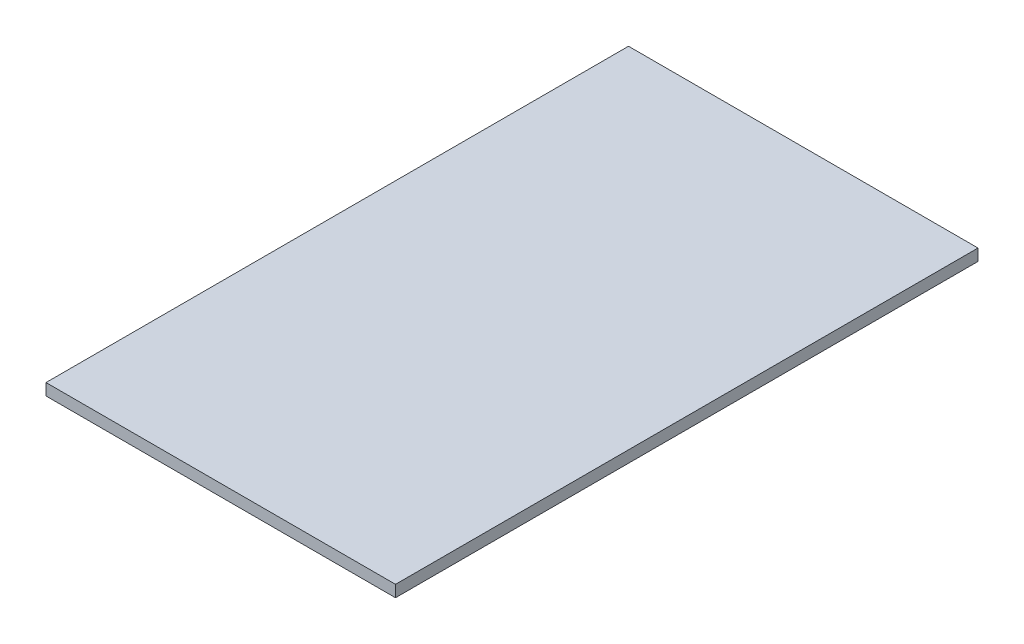
ISO-10303-21;
HEADER;
FILE_DESCRIPTION(('STEP AP214'),'2;1');
FILE_NAME('part.step','',(''),(''),'','','');
FILE_SCHEMA(('AUTOMOTIVE_DESIGN { 1 0 10303 214 1 1 1 1 }'));
ENDSEC;
DATA;
#1=APPLICATION_CONTEXT('core data for automotive mechanical design processes');
#2=APPLICATION_PROTOCOL_DEFINITION('international standard','automotive_design',2000,#1);
#3=PRODUCT_CONTEXT('',#1,'mechanical');
#4=PRODUCT('Part','Part','',(#3));
#5=PRODUCT_RELATED_PRODUCT_CATEGORY('part','',(#4));
#6=PRODUCT_DEFINITION_FORMATION('','',#4);
#7=PRODUCT_DEFINITION_CONTEXT('part definition',#1,'design');
#8=PRODUCT_DEFINITION('design','',#6,#7);
#9=PRODUCT_DEFINITION_SHAPE('','',#8);
#10=(LENGTH_UNIT() NAMED_UNIT(*) SI_UNIT(.MILLI.,.METRE.));
#11=(NAMED_UNIT(*) PLANE_ANGLE_UNIT() SI_UNIT($,.RADIAN.));
#12=(NAMED_UNIT(*) SI_UNIT($,.STERADIAN.) SOLID_ANGLE_UNIT());
#13=UNCERTAINTY_MEASURE_WITH_UNIT(LENGTH_MEASURE(1.E-05),#10,'distance_accuracy_value','');
#14=(GEOMETRIC_REPRESENTATION_CONTEXT(3) GLOBAL_UNCERTAINTY_ASSIGNED_CONTEXT((#13)) GLOBAL_UNIT_ASSIGNED_CONTEXT((#10,
#11,#12)) REPRESENTATION_CONTEXT('',''));
#15=CARTESIAN_POINT('',(0.,0.,0.));
#16=DIRECTION('',(0.,0.,1.));
#17=DIRECTION('',(1.,0.,0.));
#18=AXIS2_PLACEMENT_3D('',#15,#16,#17);
#19=CARTESIAN_POINT('',(38.1,2.54,63.5));
#20=DIRECTION('',(-1.,0.,0.));
#21=DIRECTION('',(0.,0.,1.));
#22=AXIS2_PLACEMENT_3D('',#19,#20,#21);
#23=PLANE('',#22);
#24=DIRECTION('',(0.,0.,-1.));
#25=VECTOR('',#24,1.);
#26=CARTESIAN_POINT('',(38.1,0.,63.5));
#27=LINE('',#26,#25);
#28=CARTESIAN_POINT('',(38.1,0.,63.5));
#29=VERTEX_POINT('',#28);
#30=CARTESIAN_POINT('',(38.1,0.,-63.5));
#31=VERTEX_POINT('',#30);
#32=EDGE_CURVE('E107',#29,#31,#27,.T.);
#33=ORIENTED_EDGE('',*,*,#32,.T.);
#34=DIRECTION('',(0.,-1.,0.));
#35=VECTOR('',#34,1.);
#36=CARTESIAN_POINT('',(38.1,2.54,-63.5));
#37=LINE('',#36,#35);
#38=CARTESIAN_POINT('',(38.1,2.54,-63.5));
#39=VERTEX_POINT('',#38);
#40=EDGE_CURVE('E11',#39,#31,#37,.T.);
#41=ORIENTED_EDGE('',*,*,#40,.F.);
#42=DIRECTION('',(0.,0.,-1.));
#43=VECTOR('',#42,1.);
#44=CARTESIAN_POINT('',(38.1,2.54,63.5));
#45=LINE('',#44,#43);
#46=CARTESIAN_POINT('',(38.1,2.54,63.5));
#47=VERTEX_POINT('',#46);
#48=EDGE_CURVE('E91',#47,#39,#45,.T.);
#49=ORIENTED_EDGE('',*,*,#48,.F.);
#50=DIRECTION('',(0.,-1.,0.));
#51=VECTOR('',#50,1.);
#52=CARTESIAN_POINT('',(38.1,2.54,63.5));
#53=LINE('',#52,#51);
#54=EDGE_CURVE('E103',#47,#29,#53,.T.);
#55=ORIENTED_EDGE('',*,*,#54,.T.);
#56=EDGE_LOOP('',(#33,#41,#49,#55));
#57=FACE_BOUND('',#56,.T.);
#58=ADVANCED_FACE('F39',(#57),#23,.F.);
#59=CARTESIAN_POINT('',(-38.1,2.54,-63.5));
#60=DIRECTION('',(0.,0.,1.));
#61=DIRECTION('',(1.,0.,0.));
#62=AXIS2_PLACEMENT_3D('',#59,#60,#61);
#63=PLANE('',#62);
#64=DIRECTION('',(-1.,0.,0.));
#65=VECTOR('',#64,1.);
#66=CARTESIAN_POINT('',(-38.1,0.,-63.5));
#67=LINE('',#66,#65);
#68=CARTESIAN_POINT('',(-38.1,0.,-63.5));
#69=VERTEX_POINT('',#68);
#70=EDGE_CURVE('E96',#31,#69,#67,.T.);
#71=ORIENTED_EDGE('',*,*,#70,.T.);
#72=DIRECTION('',(0.,-1.,0.));
#73=VECTOR('',#72,1.);
#74=CARTESIAN_POINT('',(-38.1,2.54,-63.5));
#75=LINE('',#74,#73);
#76=CARTESIAN_POINT('',(-38.1,2.54,-63.5));
#77=VERTEX_POINT('',#76);
#78=EDGE_CURVE('E48',#77,#69,#75,.T.);
#79=ORIENTED_EDGE('',*,*,#78,.F.);
#80=DIRECTION('',(-1.,0.,0.));
#81=VECTOR('',#80,1.);
#82=CARTESIAN_POINT('',(-38.1,2.54,-63.5));
#83=LINE('',#82,#81);
#84=EDGE_CURVE('E86',#39,#77,#83,.T.);
#85=ORIENTED_EDGE('',*,*,#84,.F.);
#86=ORIENTED_EDGE('',*,*,#40,.T.);
#87=EDGE_LOOP('',(#71,#79,#85,#86));
#88=FACE_BOUND('',#87,.T.);
#89=ADVANCED_FACE('F95',(#88),#63,.F.);
#90=CARTESIAN_POINT('',(-38.1,2.54,63.5));
#91=DIRECTION('',(1.,0.,0.));
#92=DIRECTION('',(0.,0.,-1.));
#93=AXIS2_PLACEMENT_3D('',#90,#91,#92);
#94=PLANE('',#93);
#95=DIRECTION('',(0.,0.,1.));
#96=VECTOR('',#95,1.);
#97=CARTESIAN_POINT('',(-38.1,0.,63.5));
#98=LINE('',#97,#96);
#99=CARTESIAN_POINT('',(-38.1,0.,63.5));
#100=VERTEX_POINT('',#99);
#101=EDGE_CURVE('E73',#69,#100,#98,.T.);
#102=ORIENTED_EDGE('',*,*,#101,.T.);
#103=DIRECTION('',(0.,-1.,0.));
#104=VECTOR('',#103,1.);
#105=CARTESIAN_POINT('',(-38.1,2.54,63.5));
#106=LINE('',#105,#104);
#107=CARTESIAN_POINT('',(-38.1,2.54,63.5));
#108=VERTEX_POINT('',#107);
#109=EDGE_CURVE('E98',#108,#100,#106,.T.);
#110=ORIENTED_EDGE('',*,*,#109,.F.);
#111=DIRECTION('',(0.,0.,1.));
#112=VECTOR('',#111,1.);
#113=CARTESIAN_POINT('',(-38.1,2.54,63.5));
#114=LINE('',#113,#112);
#115=EDGE_CURVE('E89',#77,#108,#114,.T.);
#116=ORIENTED_EDGE('',*,*,#115,.F.);
#117=ORIENTED_EDGE('',*,*,#78,.T.);
#118=EDGE_LOOP('',(#102,#110,#116,#117));
#119=FACE_BOUND('',#118,.T.);
#120=ADVANCED_FACE('F99',(#119),#94,.F.);
#121=CARTESIAN_POINT('',(-38.1,2.54,63.5));
#122=DIRECTION('',(0.,0.,-1.));
#123=DIRECTION('',(-1.,0.,0.));
#124=AXIS2_PLACEMENT_3D('',#121,#122,#123);
#125=PLANE('',#124);
#126=DIRECTION('',(1.,0.,0.));
#127=VECTOR('',#126,1.);
#128=CARTESIAN_POINT('',(-38.1,0.,63.5));
#129=LINE('',#128,#127);
#130=EDGE_CURVE('E79',#100,#29,#129,.T.);
#131=ORIENTED_EDGE('',*,*,#130,.T.);
#132=ORIENTED_EDGE('',*,*,#54,.F.);
#133=DIRECTION('',(1.,0.,0.));
#134=VECTOR('',#133,1.);
#135=CARTESIAN_POINT('',(-38.1,2.54,63.5));
#136=LINE('',#135,#134);
#137=EDGE_CURVE('E56',#108,#47,#136,.T.);
#138=ORIENTED_EDGE('',*,*,#137,.F.);
#139=ORIENTED_EDGE('',*,*,#109,.T.);
#140=EDGE_LOOP('',(#131,#132,#138,#139));
#141=FACE_BOUND('',#140,.T.);
#142=ADVANCED_FACE('F120',(#141),#125,.F.);
#143=CARTESIAN_POINT('',(0.,2.54,0.));
#144=DIRECTION('',(0.,-1.,0.));
#145=DIRECTION('',(0.,0.,-1.));
#146=AXIS2_PLACEMENT_3D('',#143,#144,#145);
#147=PLANE('',#146);
#148=ORIENTED_EDGE('',*,*,#48,.T.);
#149=ORIENTED_EDGE('',*,*,#84,.T.);
#150=ORIENTED_EDGE('',*,*,#115,.T.);
#151=ORIENTED_EDGE('',*,*,#137,.T.);
#152=EDGE_LOOP('',(#148,#149,#150,#151));
#153=FACE_BOUND('',#152,.T.);
#154=ADVANCED_FACE('F87',(#153),#147,.F.);
#155=CARTESIAN_POINT('',(0.,0.,0.));
#156=DIRECTION('',(0.,-1.,0.));
#157=DIRECTION('',(0.,0.,-1.));
#158=AXIS2_PLACEMENT_3D('',#155,#156,#157);
#159=PLANE('',#158);
#160=ORIENTED_EDGE('',*,*,#32,.F.);
#161=ORIENTED_EDGE('',*,*,#130,.F.);
#162=ORIENTED_EDGE('',*,*,#101,.F.);
#163=ORIENTED_EDGE('',*,*,#70,.F.);
#164=EDGE_LOOP('',(#160,#161,#162,#163));
#165=FACE_BOUND('',#164,.T.);
#166=ADVANCED_FACE('F123',(#165),#159,.T.);
#167=CLOSED_SHELL('',(#58,#89,#120,#142,#154,#166));
#168=MANIFOLD_SOLID_BREP('B2',#167);
#169=ADVANCED_BREP_SHAPE_REPRESENTATION('',(#18,#168),#14);
#170=SHAPE_DEFINITION_REPRESENTATION(#9,#169);
ENDSEC;
END-ISO-10303-21;
